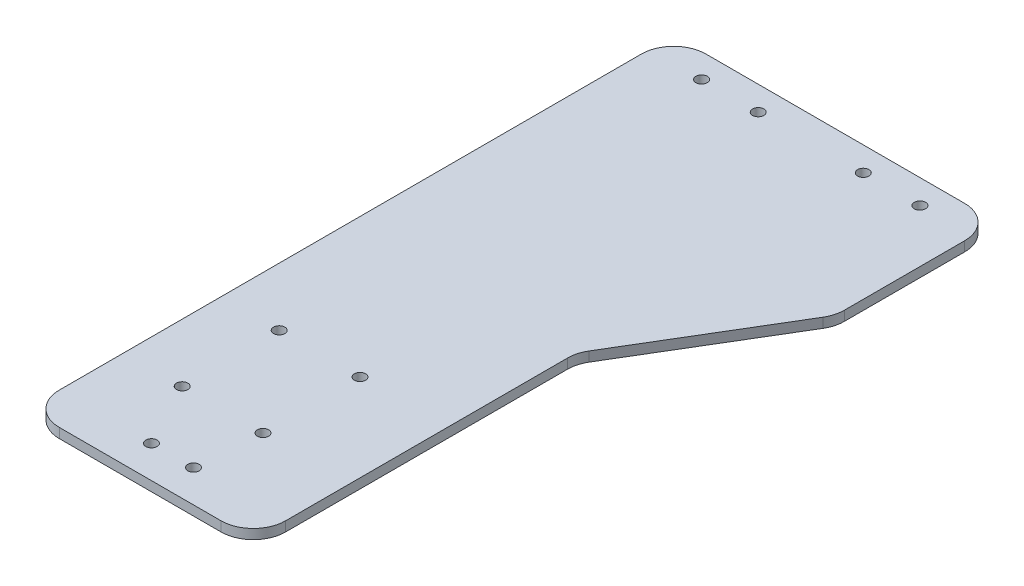
ISO-10303-21;
HEADER;
FILE_DESCRIPTION(('STEP AP214'),'2;1');
FILE_NAME('part.step','',(''),(''),'','','');
FILE_SCHEMA(('AUTOMOTIVE_DESIGN { 1 0 10303 214 1 1 1 1 }'));
ENDSEC;
DATA;
#1=APPLICATION_CONTEXT('core data for automotive mechanical design processes');
#2=APPLICATION_PROTOCOL_DEFINITION('international standard','automotive_design',2000,#1);
#3=PRODUCT_CONTEXT('',#1,'mechanical');
#4=PRODUCT('Part','Part','',(#3));
#5=PRODUCT_RELATED_PRODUCT_CATEGORY('part','',(#4));
#6=PRODUCT_DEFINITION_FORMATION('','',#4);
#7=PRODUCT_DEFINITION_CONTEXT('part definition',#1,'design');
#8=PRODUCT_DEFINITION('design','',#6,#7);
#9=PRODUCT_DEFINITION_SHAPE('','',#8);
#10=(LENGTH_UNIT() NAMED_UNIT(*) SI_UNIT(.MILLI.,.METRE.));
#11=(NAMED_UNIT(*) PLANE_ANGLE_UNIT() SI_UNIT($,.RADIAN.));
#12=(NAMED_UNIT(*) SI_UNIT($,.STERADIAN.) SOLID_ANGLE_UNIT());
#13=UNCERTAINTY_MEASURE_WITH_UNIT(LENGTH_MEASURE(1.E-05),#10,'distance_accuracy_value','');
#14=(GEOMETRIC_REPRESENTATION_CONTEXT(3) GLOBAL_UNCERTAINTY_ASSIGNED_CONTEXT((#13)) GLOBAL_UNIT_ASSIGNED_CONTEXT((#10,
#11,#12)) REPRESENTATION_CONTEXT('',''));
#15=CARTESIAN_POINT('',(0.,0.,0.));
#16=DIRECTION('',(0.,0.,1.));
#17=DIRECTION('',(1.,0.,0.));
#18=AXIS2_PLACEMENT_3D('',#15,#16,#17);
#19=CARTESIAN_POINT('',(50.,3.,100.));
#20=DIRECTION('',(-1.,0.,0.));
#21=DIRECTION('',(0.,0.,1.));
#22=AXIS2_PLACEMENT_3D('',#19,#20,#21);
#23=PLANE('',#22);
#24=DIRECTION('',(0.,0.,-1.));
#25=VECTOR('',#24,1.);
#26=CARTESIAN_POINT('',(50.,0.,100.));
#27=LINE('',#26,#25);
#28=CARTESIAN_POINT('',(50.,0.,-52.7698396494843));
#29=VERTEX_POINT('',#28);
#30=CARTESIAN_POINT('',(50.,0.,-90.));
#31=VERTEX_POINT('',#30);
#32=EDGE_CURVE('E161',#29,#31,#27,.T.);
#33=ORIENTED_EDGE('',*,*,#32,.T.);
#34=DIRECTION('',(0.,-1.,0.));
#35=VECTOR('',#34,1.);
#36=CARTESIAN_POINT('',(50.,3.,-90.));
#37=LINE('',#36,#35);
#38=CARTESIAN_POINT('',(50.,3.,-90.));
#39=VERTEX_POINT('',#38);
#40=EDGE_CURVE('E140',#31,#39,#37,.F.);
#41=ORIENTED_EDGE('',*,*,#40,.T.);
#42=DIRECTION('',(0.,0.,-1.));
#43=VECTOR('',#42,1.);
#44=CARTESIAN_POINT('',(50.,3.,100.));
#45=LINE('',#44,#43);
#46=CARTESIAN_POINT('',(50.,3.,-52.7698396494843));
#47=VERTEX_POINT('',#46);
#48=EDGE_CURVE('E171',#47,#39,#45,.T.);
#49=ORIENTED_EDGE('',*,*,#48,.F.);
#50=DIRECTION('',(0.,1.,0.));
#51=VECTOR('',#50,1.);
#52=CARTESIAN_POINT('',(50.,3.,-52.7698396494843));
#53=LINE('',#52,#51);
#54=EDGE_CURVE('E145',#47,#29,#53,.F.);
#55=ORIENTED_EDGE('',*,*,#54,.T.);
#56=EDGE_LOOP('',(#33,#41,#49,#55));
#57=FACE_BOUND('',#56,.T.);
#58=ADVANCED_FACE('F43',(#57),#23,.F.);
#59=CARTESIAN_POINT('',(-50.,3.,-100.));
#60=DIRECTION('',(0.,0.,1.));
#61=DIRECTION('',(1.,0.,0.));
#62=AXIS2_PLACEMENT_3D('',#59,#60,#61);
#63=PLANE('',#62);
#64=DIRECTION('',(-1.,0.,0.));
#65=VECTOR('',#64,1.);
#66=CARTESIAN_POINT('',(-50.,3.,-100.));
#67=LINE('',#66,#65);
#68=CARTESIAN_POINT('',(40.,3.,-100.));
#69=VERTEX_POINT('',#68);
#70=CARTESIAN_POINT('',(-40.,3.,-100.));
#71=VERTEX_POINT('',#70);
#72=EDGE_CURVE('E154',#69,#71,#67,.T.);
#73=ORIENTED_EDGE('',*,*,#72,.F.);
#74=DIRECTION('',(0.,-1.,0.));
#75=VECTOR('',#74,1.);
#76=CARTESIAN_POINT('',(40.,3.,-100.));
#77=LINE('',#76,#75);
#78=CARTESIAN_POINT('',(40.,0.,-100.));
#79=VERTEX_POINT('',#78);
#80=EDGE_CURVE('E139',#69,#79,#77,.T.);
#81=ORIENTED_EDGE('',*,*,#80,.T.);
#82=DIRECTION('',(-1.,0.,0.));
#83=VECTOR('',#82,1.);
#84=CARTESIAN_POINT('',(-50.,0.,-100.));
#85=LINE('',#84,#83);
#86=CARTESIAN_POINT('',(-40.,0.,-100.));
#87=VERTEX_POINT('',#86);
#88=EDGE_CURVE('E152',#79,#87,#85,.T.);
#89=ORIENTED_EDGE('',*,*,#88,.T.);
#90=DIRECTION('',(0.,-1.,0.));
#91=VECTOR('',#90,1.);
#92=CARTESIAN_POINT('',(-40.,3.,-100.));
#93=LINE('',#92,#91);
#94=EDGE_CURVE('E156',#87,#71,#93,.F.);
#95=ORIENTED_EDGE('',*,*,#94,.T.);
#96=EDGE_LOOP('',(#73,#81,#89,#95));
#97=FACE_BOUND('',#96,.T.);
#98=ADVANCED_FACE('F151',(#97),#63,.F.);
#99=CARTESIAN_POINT('',(-50.,3.,100.));
#100=DIRECTION('',(1.,0.,0.));
#101=DIRECTION('',(0.,0.,-1.));
#102=AXIS2_PLACEMENT_3D('',#99,#100,#101);
#103=PLANE('',#102);
#104=DIRECTION('',(0.,0.,1.));
#105=VECTOR('',#104,1.);
#106=CARTESIAN_POINT('',(-50.,3.,100.));
#107=LINE('',#106,#105);
#108=CARTESIAN_POINT('',(-50.,3.,-90.));
#109=VERTEX_POINT('',#108);
#110=CARTESIAN_POINT('',(-50.,3.,90.));
#111=VERTEX_POINT('',#110);
#112=EDGE_CURVE('E279',#109,#111,#107,.T.);
#113=ORIENTED_EDGE('',*,*,#112,.F.);
#114=DIRECTION('',(0.,-1.,0.));
#115=VECTOR('',#114,1.);
#116=CARTESIAN_POINT('',(-50.,3.,-90.));
#117=LINE('',#116,#115);
#118=CARTESIAN_POINT('',(-50.,0.,-90.));
#119=VERTEX_POINT('',#118);
#120=EDGE_CURVE('E198',#109,#119,#117,.T.);
#121=ORIENTED_EDGE('',*,*,#120,.T.);
#122=DIRECTION('',(0.,0.,1.));
#123=VECTOR('',#122,1.);
#124=CARTESIAN_POINT('',(-50.,0.,100.));
#125=LINE('',#124,#123);
#126=CARTESIAN_POINT('',(-50.,0.,90.));
#127=VERTEX_POINT('',#126);
#128=EDGE_CURVE('E160',#119,#127,#125,.T.);
#129=ORIENTED_EDGE('',*,*,#128,.T.);
#130=DIRECTION('',(0.,-1.,0.));
#131=VECTOR('',#130,1.);
#132=CARTESIAN_POINT('',(-50.,3.,90.));
#133=LINE('',#132,#131);
#134=EDGE_CURVE('E60',#127,#111,#133,.F.);
#135=ORIENTED_EDGE('',*,*,#134,.T.);
#136=EDGE_LOOP('',(#113,#121,#129,#135));
#137=FACE_BOUND('',#136,.T.);
#138=ADVANCED_FACE('F292',(#137),#103,.F.);
#139=CARTESIAN_POINT('',(-50.,3.,100.));
#140=DIRECTION('',(0.,0.,-1.));
#141=DIRECTION('',(-1.,0.,0.));
#142=AXIS2_PLACEMENT_3D('',#139,#140,#141);
#143=PLANE('',#142);
#144=DIRECTION('',(1.,0.,0.));
#145=VECTOR('',#144,1.);
#146=CARTESIAN_POINT('',(-50.,3.,100.));
#147=LINE('',#146,#145);
#148=CARTESIAN_POINT('',(-40.,3.,100.));
#149=VERTEX_POINT('',#148);
#150=CARTESIAN_POINT('',(9.99999999999999,3.,100.));
#151=VERTEX_POINT('',#150);
#152=EDGE_CURVE('E176',#149,#151,#147,.T.);
#153=ORIENTED_EDGE('',*,*,#152,.F.);
#154=DIRECTION('',(0.,-1.,0.));
#155=VECTOR('',#154,1.);
#156=CARTESIAN_POINT('',(-40.,3.,100.));
#157=LINE('',#156,#155);
#158=CARTESIAN_POINT('',(-40.,0.,100.));
#159=VERTEX_POINT('',#158);
#160=EDGE_CURVE('E204',#149,#159,#157,.T.);
#161=ORIENTED_EDGE('',*,*,#160,.T.);
#162=DIRECTION('',(1.,0.,0.));
#163=VECTOR('',#162,1.);
#164=CARTESIAN_POINT('',(-50.,0.,100.));
#165=LINE('',#164,#163);
#166=CARTESIAN_POINT('',(9.99999999999999,0.,100.));
#167=VERTEX_POINT('',#166);
#168=EDGE_CURVE('E163',#159,#167,#165,.T.);
#169=ORIENTED_EDGE('',*,*,#168,.T.);
#170=DIRECTION('',(0.,1.,0.));
#171=VECTOR('',#170,1.);
#172=CARTESIAN_POINT('',(9.99999999999999,3.,100.));
#173=LINE('',#172,#171);
#174=EDGE_CURVE('E201',#167,#151,#173,.T.);
#175=ORIENTED_EDGE('',*,*,#174,.T.);
#176=EDGE_LOOP('',(#153,#161,#169,#175));
#177=FACE_BOUND('',#176,.T.);
#178=ADVANCED_FACE('F287',(#177),#143,.F.);
#179=CARTESIAN_POINT('',(0.,3.,0.));
#180=DIRECTION('',(0.,-1.,0.));
#181=DIRECTION('',(0.,0.,-1.));
#182=AXIS2_PLACEMENT_3D('',#179,#180,#181);
#183=PLANE('',#182);
#184=CARTESIAN_POINT('',(-32.,3.,70.0000000000021));
#185=DIRECTION('',(0.,1.,0.));
#186=DIRECTION('',(0.,0.,-1.));
#187=AXIS2_PLACEMENT_3D('',#184,#185,#186);
#188=CIRCLE('',#187,1.75);
#189=CARTESIAN_POINT('',(-32.,3.,68.2500000000021));
#190=VERTEX_POINT('',#189);
#191=EDGE_CURVE('E578',#190,#190,#188,.T.);
#192=ORIENTED_EDGE('',*,*,#191,.F.);
#193=EDGE_LOOP('',(#192));
#194=FACE_BOUND('',#193,.T.);
#195=CARTESIAN_POINT('',(-7.,3.,70.0000000000021));
#196=DIRECTION('',(0.,1.,0.));
#197=DIRECTION('',(0.,0.,-1.));
#198=AXIS2_PLACEMENT_3D('',#195,#196,#197);
#199=CIRCLE('',#198,1.75000000000001);
#200=CARTESIAN_POINT('',(-7.,3.,68.2500000000021));
#201=VERTEX_POINT('',#200);
#202=EDGE_CURVE('E579',#201,#201,#199,.T.);
#203=ORIENTED_EDGE('',*,*,#202,.F.);
#204=EDGE_LOOP('',(#203));
#205=FACE_BOUND('',#204,.T.);
#206=CARTESIAN_POINT('',(-7.00000000000001,3.,40.0000000000021));
#207=DIRECTION('',(0.,1.,0.));
#208=DIRECTION('',(0.,0.,1.));
#209=AXIS2_PLACEMENT_3D('',#206,#207,#208);
#210=CIRCLE('',#209,1.75000000000001);
#211=CARTESIAN_POINT('',(-7.00000000000001,3.,41.7500000000021));
#212=VERTEX_POINT('',#211);
#213=EDGE_CURVE('E582',#212,#212,#210,.T.);
#214=ORIENTED_EDGE('',*,*,#213,.F.);
#215=EDGE_LOOP('',(#214));
#216=FACE_BOUND('',#215,.T.);
#217=CARTESIAN_POINT('',(-32.,3.,40.0000000000021));
#218=DIRECTION('',(0.,1.,0.));
#219=DIRECTION('',(0.,0.,1.));
#220=AXIS2_PLACEMENT_3D('',#217,#218,#219);
#221=CIRCLE('',#220,1.75);
#222=CARTESIAN_POINT('',(-32.,3.,41.7500000000021));
#223=VERTEX_POINT('',#222);
#224=EDGE_CURVE('E236',#223,#223,#221,.T.);
#225=ORIENTED_EDGE('',*,*,#224,.F.);
#226=EDGE_LOOP('',(#225));
#227=FACE_BOUND('',#226,.T.);
#228=CARTESIAN_POINT('',(-8.50000000000007,3.,90.0000000000001));
#229=DIRECTION('',(0.,-1.,0.));
#230=DIRECTION('',(0.,0.,-1.));
#231=AXIS2_PLACEMENT_3D('',#228,#229,#230);
#232=CIRCLE('',#231,1.75000000000001);
#233=CARTESIAN_POINT('',(-8.50000000000007,3.,88.25));
#234=VERTEX_POINT('',#233);
#235=EDGE_CURVE('E258',#234,#234,#232,.T.);
#236=ORIENTED_EDGE('',*,*,#235,.T.);
#237=EDGE_LOOP('',(#236));
#238=FACE_BOUND('',#237,.T.);
#239=CARTESIAN_POINT('',(-21.5000000000001,3.,90.0000000000001));
#240=DIRECTION('',(0.,-1.,0.));
#241=DIRECTION('',(0.,0.,-1.));
#242=AXIS2_PLACEMENT_3D('',#239,#240,#241);
#243=CIRCLE('',#242,1.75000000000001);
#244=CARTESIAN_POINT('',(-21.5000000000001,3.,88.25));
#245=VERTEX_POINT('',#244);
#246=EDGE_CURVE('E252',#245,#245,#243,.T.);
#247=ORIENTED_EDGE('',*,*,#246,.T.);
#248=EDGE_LOOP('',(#247));
#249=FACE_BOUND('',#248,.T.);
#250=CARTESIAN_POINT('',(33.6473971870736,3.,-92.5000000000002));
#251=DIRECTION('',(0.,1.,0.));
#252=DIRECTION('',(0.,0.,1.));
#253=AXIS2_PLACEMENT_3D('',#250,#251,#252);
#254=CIRCLE('',#253,1.75000000000167);
#255=CARTESIAN_POINT('',(33.6473971870736,3.,-90.7499999999985));
#256=VERTEX_POINT('',#255);
#257=EDGE_CURVE('E222',#256,#256,#254,.T.);
#258=ORIENTED_EDGE('',*,*,#257,.F.);
#259=EDGE_LOOP('',(#258));
#260=FACE_BOUND('',#259,.T.);
#261=CARTESIAN_POINT('',(-16.3526028129264,3.,-92.5));
#262=DIRECTION('',(0.,1.,0.));
#263=DIRECTION('',(0.,0.,1.));
#264=AXIS2_PLACEMENT_3D('',#261,#262,#263);
#265=CIRCLE('',#264,1.74999999999997);
#266=CARTESIAN_POINT('',(-16.3526028129264,3.,-90.75));
#267=VERTEX_POINT('',#266);
#268=EDGE_CURVE('E261',#267,#267,#265,.T.);
#269=ORIENTED_EDGE('',*,*,#268,.F.);
#270=EDGE_LOOP('',(#269));
#271=FACE_BOUND('',#270,.T.);
#272=CARTESIAN_POINT('',(-33.8673309883633,3.,-92.5));
#273=DIRECTION('',(0.,1.,0.));
#274=DIRECTION('',(0.,0.,1.));
#275=AXIS2_PLACEMENT_3D('',#272,#273,#274);
#276=CIRCLE('',#275,1.74999999999997);
#277=CARTESIAN_POINT('',(-33.8673309883633,3.,-90.75));
#278=VERTEX_POINT('',#277);
#279=EDGE_CURVE('E267',#278,#278,#276,.T.);
#280=ORIENTED_EDGE('',*,*,#279,.F.);
#281=EDGE_LOOP('',(#280));
#282=FACE_BOUND('',#281,.T.);
#283=CARTESIAN_POINT('',(16.1326690116367,3.,-92.5000000000002));
#284=DIRECTION('',(0.,1.,0.));
#285=DIRECTION('',(0.,0.,1.));
#286=AXIS2_PLACEMENT_3D('',#283,#284,#285);
#287=CIRCLE('',#286,1.75000000000167);
#288=CARTESIAN_POINT('',(16.1326690116367,3.,-90.7499999999985));
#289=VERTEX_POINT('',#288);
#290=EDGE_CURVE('E264',#289,#289,#287,.T.);
#291=ORIENTED_EDGE('',*,*,#290,.F.);
#292=EDGE_LOOP('',(#291));
#293=FACE_BOUND('',#292,.T.);
#294=ORIENTED_EDGE('',*,*,#48,.T.);
#295=CARTESIAN_POINT('',(40.,3.,-90.));
#296=DIRECTION('',(0.,-1.,0.));
#297=DIRECTION('',(0.,0.,-1.));
#298=AXIS2_PLACEMENT_3D('',#295,#296,#297);
#299=CIRCLE('',#298,10.);
#300=EDGE_CURVE('E195',#39,#69,#299,.F.);
#301=ORIENTED_EDGE('',*,*,#300,.T.);
#302=ORIENTED_EDGE('',*,*,#72,.T.);
#303=CARTESIAN_POINT('',(-40.,3.,-90.));
#304=DIRECTION('',(0.,-1.,0.));
#305=DIRECTION('',(0.,0.,-1.));
#306=AXIS2_PLACEMENT_3D('',#303,#304,#305);
#307=CIRCLE('',#306,10.);
#308=EDGE_CURVE('E67',#71,#109,#307,.F.);
#309=ORIENTED_EDGE('',*,*,#308,.T.);
#310=ORIENTED_EDGE('',*,*,#112,.T.);
#311=CARTESIAN_POINT('',(-40.,3.,90.));
#312=DIRECTION('',(0.,-1.,0.));
#313=DIRECTION('',(0.,0.,-1.));
#314=AXIS2_PLACEMENT_3D('',#311,#312,#313);
#315=CIRCLE('',#314,10.);
#316=EDGE_CURVE('E192',#111,#149,#315,.F.);
#317=ORIENTED_EDGE('',*,*,#316,.T.);
#318=ORIENTED_EDGE('',*,*,#152,.T.);
#319=CARTESIAN_POINT('',(9.99999999999999,3.,90.));
#320=DIRECTION('',(0.,-1.,0.));
#321=DIRECTION('',(0.,0.,-1.));
#322=AXIS2_PLACEMENT_3D('',#319,#320,#321);
#323=CIRCLE('',#322,10.);
#324=CARTESIAN_POINT('',(20.,3.,90.));
#325=VERTEX_POINT('',#324);
#326=EDGE_CURVE('E190',#151,#325,#323,.F.);
#327=ORIENTED_EDGE('',*,*,#326,.T.);
#328=DIRECTION('',(0.,0.,1.));
#329=VECTOR('',#328,1.);
#330=CARTESIAN_POINT('',(20.,3.,100.));
#331=LINE('',#330,#329);
#332=CARTESIAN_POINT('',(20.,3.,2.76983964948434));
#333=VERTEX_POINT('',#332);
#334=EDGE_CURVE('E165',#333,#325,#331,.T.);
#335=ORIENTED_EDGE('',*,*,#334,.F.);
#336=CARTESIAN_POINT('',(30.,3.,2.76983964948434));
#337=DIRECTION('',(0.,-1.,0.));
#338=DIRECTION('',(0.,0.,-1.));
#339=AXIS2_PLACEMENT_3D('',#336,#337,#338);
#340=CIRCLE('',#339,10.);
#341=CARTESIAN_POINT('',(21.4250707428746,3.,-2.37511790479093));
#342=VERTEX_POINT('',#341);
#343=EDGE_CURVE('E52',#333,#342,#340,.T.);
#344=ORIENTED_EDGE('',*,*,#343,.T.);
#345=DIRECTION('',(-0.514495755427527,0.,0.857492925712544));
#346=VECTOR('',#345,1.);
#347=CARTESIAN_POINT('',(20.,3.,0.));
#348=LINE('',#347,#346);
#349=CARTESIAN_POINT('',(48.5749292571254,3.,-47.6248820952091));
#350=VERTEX_POINT('',#349);
#351=EDGE_CURVE('E231',#350,#342,#348,.T.);
#352=ORIENTED_EDGE('',*,*,#351,.F.);
#353=CARTESIAN_POINT('',(40.,3.,-52.7698396494843));
#354=DIRECTION('',(0.,-1.,0.));
#355=DIRECTION('',(0.,0.,-1.));
#356=AXIS2_PLACEMENT_3D('',#353,#354,#355);
#357=CIRCLE('',#356,10.);
#358=EDGE_CURVE('E188',#350,#47,#357,.F.);
#359=ORIENTED_EDGE('',*,*,#358,.T.);
#360=EDGE_LOOP('',(#294,#301,#302,#309,#310,#317,#318,#327,#335,#344,#352,#359));
#361=FACE_BOUND('',#360,.T.);
#362=ADVANCED_FACE('F282',(#194,#205,#216,#227,#238,#249,#260,#271,#282,#293,#361),#183,.F.);
#363=CARTESIAN_POINT('',(0.,0.,0.));
#364=DIRECTION('',(0.,-1.,0.));
#365=DIRECTION('',(0.,0.,-1.));
#366=AXIS2_PLACEMENT_3D('',#363,#364,#365);
#367=PLANE('',#366);
#368=CARTESIAN_POINT('',(-32.,0.,70.0000000000021));
#369=DIRECTION('',(0.,-1.,0.));
#370=DIRECTION('',(0.,0.,-1.));
#371=AXIS2_PLACEMENT_3D('',#368,#369,#370);
#372=CIRCLE('',#371,1.75);
#373=CARTESIAN_POINT('',(-32.,0.,68.2500000000021));
#374=VERTEX_POINT('',#373);
#375=EDGE_CURVE('E47',#374,#374,#372,.T.);
#376=ORIENTED_EDGE('',*,*,#375,.F.);
#377=EDGE_LOOP('',(#376));
#378=FACE_BOUND('',#377,.T.);
#379=CARTESIAN_POINT('',(-7.,0.,70.0000000000021));
#380=DIRECTION('',(0.,-1.,0.));
#381=DIRECTION('',(0.,0.,-1.));
#382=AXIS2_PLACEMENT_3D('',#379,#380,#381);
#383=CIRCLE('',#382,1.75000000000001);
#384=CARTESIAN_POINT('',(-7.,0.,68.2500000000021));
#385=VERTEX_POINT('',#384);
#386=EDGE_CURVE('E238',#385,#385,#383,.T.);
#387=ORIENTED_EDGE('',*,*,#386,.F.);
#388=EDGE_LOOP('',(#387));
#389=FACE_BOUND('',#388,.T.);
#390=CARTESIAN_POINT('',(-7.00000000000001,0.,40.0000000000021));
#391=DIRECTION('',(0.,-1.,0.));
#392=DIRECTION('',(0.,0.,-1.));
#393=AXIS2_PLACEMENT_3D('',#390,#391,#392);
#394=CIRCLE('',#393,1.75000000000001);
#395=CARTESIAN_POINT('',(-7.00000000000001,0.,38.2500000000021));
#396=VERTEX_POINT('',#395);
#397=EDGE_CURVE('E235',#396,#396,#394,.T.);
#398=ORIENTED_EDGE('',*,*,#397,.F.);
#399=EDGE_LOOP('',(#398));
#400=FACE_BOUND('',#399,.T.);
#401=CARTESIAN_POINT('',(-32.,0.,40.0000000000021));
#402=DIRECTION('',(0.,-1.,0.));
#403=DIRECTION('',(0.,0.,-1.));
#404=AXIS2_PLACEMENT_3D('',#401,#402,#403);
#405=CIRCLE('',#404,1.75);
#406=CARTESIAN_POINT('',(-32.,0.,38.2500000000021));
#407=VERTEX_POINT('',#406);
#408=EDGE_CURVE('E232',#407,#407,#405,.T.);
#409=ORIENTED_EDGE('',*,*,#408,.F.);
#410=EDGE_LOOP('',(#409));
#411=FACE_BOUND('',#410,.T.);
#412=CARTESIAN_POINT('',(-8.50000000000007,0.,90.0000000000001));
#413=DIRECTION('',(0.,-1.,0.));
#414=DIRECTION('',(0.,0.,-1.));
#415=AXIS2_PLACEMENT_3D('',#412,#413,#414);
#416=CIRCLE('',#415,1.75000000000001);
#417=CARTESIAN_POINT('',(-8.50000000000007,0.,88.25));
#418=VERTEX_POINT('',#417);
#419=EDGE_CURVE('E247',#418,#418,#416,.T.);
#420=ORIENTED_EDGE('',*,*,#419,.F.);
#421=EDGE_LOOP('',(#420));
#422=FACE_BOUND('',#421,.T.);
#423=CARTESIAN_POINT('',(-21.5000000000001,0.,90.0000000000001));
#424=DIRECTION('',(0.,-1.,0.));
#425=DIRECTION('',(0.,0.,-1.));
#426=AXIS2_PLACEMENT_3D('',#423,#424,#425);
#427=CIRCLE('',#426,1.75000000000001);
#428=CARTESIAN_POINT('',(-21.5000000000001,0.,88.25));
#429=VERTEX_POINT('',#428);
#430=EDGE_CURVE('E243',#429,#429,#427,.T.);
#431=ORIENTED_EDGE('',*,*,#430,.F.);
#432=EDGE_LOOP('',(#431));
#433=FACE_BOUND('',#432,.T.);
#434=CARTESIAN_POINT('',(33.6473971870736,0.,-92.5000000000002));
#435=DIRECTION('',(0.,-1.,0.));
#436=DIRECTION('',(0.,0.,-1.));
#437=AXIS2_PLACEMENT_3D('',#434,#435,#436);
#438=CIRCLE('',#437,1.75000000000167);
#439=CARTESIAN_POINT('',(33.6473971870736,0.,-94.2500000000018));
#440=VERTEX_POINT('',#439);
#441=EDGE_CURVE('E228',#440,#440,#438,.T.);
#442=ORIENTED_EDGE('',*,*,#441,.F.);
#443=EDGE_LOOP('',(#442));
#444=FACE_BOUND('',#443,.T.);
#445=CARTESIAN_POINT('',(-16.3526028129264,0.,-92.5));
#446=DIRECTION('',(0.,-1.,0.));
#447=DIRECTION('',(0.,0.,-1.));
#448=AXIS2_PLACEMENT_3D('',#445,#446,#447);
#449=CIRCLE('',#448,1.74999999999997);
#450=CARTESIAN_POINT('',(-16.3526028129264,0.,-94.25));
#451=VERTEX_POINT('',#450);
#452=EDGE_CURVE('E225',#451,#451,#449,.T.);
#453=ORIENTED_EDGE('',*,*,#452,.F.);
#454=EDGE_LOOP('',(#453));
#455=FACE_BOUND('',#454,.T.);
#456=CARTESIAN_POINT('',(-33.8673309883633,0.,-92.5));
#457=DIRECTION('',(0.,-1.,0.));
#458=DIRECTION('',(0.,0.,-1.));
#459=AXIS2_PLACEMENT_3D('',#456,#457,#458);
#460=CIRCLE('',#459,1.74999999999997);
#461=CARTESIAN_POINT('',(-33.8673309883633,0.,-94.25));
#462=VERTEX_POINT('',#461);
#463=EDGE_CURVE('E221',#462,#462,#460,.T.);
#464=ORIENTED_EDGE('',*,*,#463,.F.);
#465=EDGE_LOOP('',(#464));
#466=FACE_BOUND('',#465,.T.);
#467=CARTESIAN_POINT('',(16.1326690116367,0.,-92.5000000000002));
#468=DIRECTION('',(0.,-1.,0.));
#469=DIRECTION('',(0.,0.,-1.));
#470=AXIS2_PLACEMENT_3D('',#467,#468,#469);
#471=CIRCLE('',#470,1.75000000000167);
#472=CARTESIAN_POINT('',(16.1326690116367,0.,-94.2500000000018));
#473=VERTEX_POINT('',#472);
#474=EDGE_CURVE('E218',#473,#473,#471,.T.);
#475=ORIENTED_EDGE('',*,*,#474,.F.);
#476=EDGE_LOOP('',(#475));
#477=FACE_BOUND('',#476,.T.);
#478=ORIENTED_EDGE('',*,*,#88,.F.);
#479=CARTESIAN_POINT('',(40.,0.,-90.));
#480=DIRECTION('',(0.,-1.,0.));
#481=DIRECTION('',(0.,0.,-1.));
#482=AXIS2_PLACEMENT_3D('',#479,#480,#481);
#483=CIRCLE('',#482,10.);
#484=EDGE_CURVE('E135',#79,#31,#483,.T.);
#485=ORIENTED_EDGE('',*,*,#484,.T.);
#486=ORIENTED_EDGE('',*,*,#32,.F.);
#487=CARTESIAN_POINT('',(40.,0.,-52.7698396494843));
#488=DIRECTION('',(0.,-1.,0.));
#489=DIRECTION('',(0.,0.,-1.));
#490=AXIS2_PLACEMENT_3D('',#487,#488,#489);
#491=CIRCLE('',#490,10.);
#492=CARTESIAN_POINT('',(48.5749292571254,0.,-47.6248820952091));
#493=VERTEX_POINT('',#492);
#494=EDGE_CURVE('E155',#29,#493,#491,.T.);
#495=ORIENTED_EDGE('',*,*,#494,.T.);
#496=DIRECTION('',(0.514495755427527,0.,-0.857492925712544));
#497=VECTOR('',#496,1.);
#498=CARTESIAN_POINT('',(14.7058823529412,0.,8.8235294117647));
#499=LINE('',#498,#497);
#500=CARTESIAN_POINT('',(21.4250707428746,0.,-2.37511790479093));
#501=VERTEX_POINT('',#500);
#502=EDGE_CURVE('E172',#501,#493,#499,.T.);
#503=ORIENTED_EDGE('',*,*,#502,.F.);
#504=CARTESIAN_POINT('',(30.,0.,2.76983964948434));
#505=DIRECTION('',(0.,-1.,0.));
#506=DIRECTION('',(0.,0.,-1.));
#507=AXIS2_PLACEMENT_3D('',#504,#505,#506);
#508=CIRCLE('',#507,10.);
#509=CARTESIAN_POINT('',(20.,0.,2.76983964948434));
#510=VERTEX_POINT('',#509);
#511=EDGE_CURVE('E11',#501,#510,#508,.F.);
#512=ORIENTED_EDGE('',*,*,#511,.T.);
#513=DIRECTION('',(0.,0.,-1.));
#514=VECTOR('',#513,1.);
#515=CARTESIAN_POINT('',(20.,0.,0.));
#516=LINE('',#515,#514);
#517=CARTESIAN_POINT('',(20.,0.,90.));
#518=VERTEX_POINT('',#517);
#519=EDGE_CURVE('E175',#518,#510,#516,.T.);
#520=ORIENTED_EDGE('',*,*,#519,.F.);
#521=CARTESIAN_POINT('',(9.99999999999999,0.,90.));
#522=DIRECTION('',(0.,-1.,0.));
#523=DIRECTION('',(0.,0.,-1.));
#524=AXIS2_PLACEMENT_3D('',#521,#522,#523);
#525=CIRCLE('',#524,10.);
#526=EDGE_CURVE('E181',#518,#167,#525,.T.);
#527=ORIENTED_EDGE('',*,*,#526,.T.);
#528=ORIENTED_EDGE('',*,*,#168,.F.);
#529=CARTESIAN_POINT('',(-40.,0.,90.));
#530=DIRECTION('',(0.,-1.,0.));
#531=DIRECTION('',(0.,0.,-1.));
#532=AXIS2_PLACEMENT_3D('',#529,#530,#531);
#533=CIRCLE('',#532,10.);
#534=EDGE_CURVE('E183',#159,#127,#533,.T.);
#535=ORIENTED_EDGE('',*,*,#534,.T.);
#536=ORIENTED_EDGE('',*,*,#128,.F.);
#537=CARTESIAN_POINT('',(-40.,0.,-90.));
#538=DIRECTION('',(0.,-1.,0.));
#539=DIRECTION('',(0.,0.,-1.));
#540=AXIS2_PLACEMENT_3D('',#537,#538,#539);
#541=CIRCLE('',#540,10.);
#542=EDGE_CURVE('E146',#119,#87,#541,.T.);
#543=ORIENTED_EDGE('',*,*,#542,.T.);
#544=EDGE_LOOP('',(#478,#485,#486,#495,#503,#512,#520,#527,#528,#535,#536,#543));
#545=FACE_BOUND('',#544,.T.);
#546=ADVANCED_FACE('F158',(#378,#389,#400,#411,#422,#433,#444,#455,#466,#477,#545),#367,.T.);
#547=CARTESIAN_POINT('',(20.,-7.,100.));
#548=DIRECTION('',(-1.,0.,0.));
#549=DIRECTION('',(0.,0.,1.));
#550=AXIS2_PLACEMENT_3D('',#547,#548,#549);
#551=PLANE('',#550);
#552=ORIENTED_EDGE('',*,*,#334,.T.);
#553=DIRECTION('',(0.,1.,0.));
#554=VECTOR('',#553,1.);
#555=CARTESIAN_POINT('',(20.,-7.,90.));
#556=LINE('',#555,#554);
#557=EDGE_CURVE('E210',#325,#518,#556,.F.);
#558=ORIENTED_EDGE('',*,*,#557,.T.);
#559=ORIENTED_EDGE('',*,*,#519,.T.);
#560=DIRECTION('',(0.,1.,0.));
#561=VECTOR('',#560,1.);
#562=CARTESIAN_POINT('',(20.,3.,2.76983964948434));
#563=LINE('',#562,#561);
#564=EDGE_CURVE('E207',#510,#333,#563,.T.);
#565=ORIENTED_EDGE('',*,*,#564,.T.);
#566=EDGE_LOOP('',(#552,#558,#559,#565));
#567=FACE_BOUND('',#566,.T.);
#568=ADVANCED_FACE('F314',(#567),#551,.F.);
#569=CARTESIAN_POINT('',(20.,-7.,0.));
#570=DIRECTION('',(-0.857492925712544,0.,-0.514495755427526));
#571=DIRECTION('',(-0.514495755427527,0.,0.857492925712544));
#572=AXIS2_PLACEMENT_3D('',#569,#570,#571);
#573=PLANE('',#572);
#574=ORIENTED_EDGE('',*,*,#351,.T.);
#575=DIRECTION('',(0.,1.,0.));
#576=VECTOR('',#575,1.);
#577=CARTESIAN_POINT('',(21.4250707428746,0.,-2.37511790479093));
#578=LINE('',#577,#576);
#579=EDGE_CURVE('E215',#342,#501,#578,.F.);
#580=ORIENTED_EDGE('',*,*,#579,.T.);
#581=ORIENTED_EDGE('',*,*,#502,.T.);
#582=DIRECTION('',(0.,1.,0.));
#583=VECTOR('',#582,1.);
#584=CARTESIAN_POINT('',(48.5749292571254,-7.,-47.6248820952091));
#585=LINE('',#584,#583);
#586=EDGE_CURVE('E212',#493,#350,#585,.T.);
#587=ORIENTED_EDGE('',*,*,#586,.T.);
#588=EDGE_LOOP('',(#574,#580,#581,#587));
#589=FACE_BOUND('',#588,.T.);
#590=ADVANCED_FACE('F306',(#589),#573,.F.);
#591=CARTESIAN_POINT('',(40.,3.,-90.));
#592=DIRECTION('',(0.,-1.,0.));
#593=DIRECTION('',(0.,0.,-1.));
#594=AXIS2_PLACEMENT_3D('',#591,#592,#593);
#595=CYLINDRICAL_SURFACE('',#594,10.);
#596=ORIENTED_EDGE('',*,*,#300,.F.);
#597=ORIENTED_EDGE('',*,*,#40,.F.);
#598=ORIENTED_EDGE('',*,*,#484,.F.);
#599=ORIENTED_EDGE('',*,*,#80,.F.);
#600=EDGE_LOOP('',(#596,#597,#598,#599));
#601=FACE_BOUND('',#600,.T.);
#602=ADVANCED_FACE('F138',(#601),#595,.T.);
#603=CARTESIAN_POINT('',(-40.,3.,-90.));
#604=DIRECTION('',(0.,-1.,0.));
#605=DIRECTION('',(0.,0.,-1.));
#606=AXIS2_PLACEMENT_3D('',#603,#604,#605);
#607=CYLINDRICAL_SURFACE('',#606,10.);
#608=ORIENTED_EDGE('',*,*,#308,.F.);
#609=ORIENTED_EDGE('',*,*,#94,.F.);
#610=ORIENTED_EDGE('',*,*,#542,.F.);
#611=ORIENTED_EDGE('',*,*,#120,.F.);
#612=EDGE_LOOP('',(#608,#609,#610,#611));
#613=FACE_BOUND('',#612,.T.);
#614=ADVANCED_FACE('F295',(#613),#607,.T.);
#615=CARTESIAN_POINT('',(-40.,3.,90.));
#616=DIRECTION('',(0.,-1.,0.));
#617=DIRECTION('',(0.,0.,-1.));
#618=AXIS2_PLACEMENT_3D('',#615,#616,#617);
#619=CYLINDRICAL_SURFACE('',#618,10.);
#620=ORIENTED_EDGE('',*,*,#316,.F.);
#621=ORIENTED_EDGE('',*,*,#134,.F.);
#622=ORIENTED_EDGE('',*,*,#534,.F.);
#623=ORIENTED_EDGE('',*,*,#160,.F.);
#624=EDGE_LOOP('',(#620,#621,#622,#623));
#625=FACE_BOUND('',#624,.T.);
#626=ADVANCED_FACE('F291',(#625),#619,.T.);
#627=CARTESIAN_POINT('',(9.99999999999999,3.,90.));
#628=DIRECTION('',(0.,1.,0.));
#629=DIRECTION('',(0.,0.,1.));
#630=AXIS2_PLACEMENT_3D('',#627,#628,#629);
#631=CYLINDRICAL_SURFACE('',#630,10.);
#632=ORIENTED_EDGE('',*,*,#526,.F.);
#633=ORIENTED_EDGE('',*,*,#557,.F.);
#634=ORIENTED_EDGE('',*,*,#326,.F.);
#635=ORIENTED_EDGE('',*,*,#174,.F.);
#636=EDGE_LOOP('',(#632,#633,#634,#635));
#637=FACE_BOUND('',#636,.T.);
#638=ADVANCED_FACE('F317',(#637),#631,.T.);
#639=CARTESIAN_POINT('',(30.,-7.,2.76983964948434));
#640=DIRECTION('',(0.,-1.,0.));
#641=DIRECTION('',(0.,0.,-1.));
#642=AXIS2_PLACEMENT_3D('',#639,#640,#641);
#643=CYLINDRICAL_SURFACE('',#642,10.);
#644=ORIENTED_EDGE('',*,*,#511,.F.);
#645=ORIENTED_EDGE('',*,*,#579,.F.);
#646=ORIENTED_EDGE('',*,*,#343,.F.);
#647=ORIENTED_EDGE('',*,*,#564,.F.);
#648=EDGE_LOOP('',(#644,#645,#646,#647));
#649=FACE_BOUND('',#648,.T.);
#650=ADVANCED_FACE('F309',(#649),#643,.F.);
#651=CARTESIAN_POINT('',(40.,-7.,-52.7698396494843));
#652=DIRECTION('',(0.,1.,0.));
#653=DIRECTION('',(0.,0.,1.));
#654=AXIS2_PLACEMENT_3D('',#651,#652,#653);
#655=CYLINDRICAL_SURFACE('',#654,10.);
#656=ORIENTED_EDGE('',*,*,#494,.F.);
#657=ORIENTED_EDGE('',*,*,#54,.F.);
#658=ORIENTED_EDGE('',*,*,#358,.F.);
#659=ORIENTED_EDGE('',*,*,#586,.F.);
#660=EDGE_LOOP('',(#656,#657,#658,#659));
#661=FACE_BOUND('',#660,.T.);
#662=ADVANCED_FACE('F45',(#661),#655,.T.);
#663=CARTESIAN_POINT('',(16.1326690116367,-18.,-92.5000000000002));
#664=DIRECTION('',(0.,1.,0.));
#665=DIRECTION('',(0.,0.,1.));
#666=AXIS2_PLACEMENT_3D('',#663,#664,#665);
#667=CYLINDRICAL_SURFACE('',#666,1.75000000000167);
#668=ORIENTED_EDGE('',*,*,#474,.T.);
#669=EDGE_LOOP('',(#668));
#670=FACE_BOUND('',#669,.T.);
#671=ORIENTED_EDGE('',*,*,#290,.T.);
#672=EDGE_LOOP('',(#671));
#673=FACE_BOUND('',#672,.T.);
#674=ADVANCED_FACE('F367',(#670,#673),#667,.F.);
#675=CARTESIAN_POINT('',(-33.8673309883633,-18.,-92.5));
#676=DIRECTION('',(0.,1.,0.));
#677=DIRECTION('',(0.,0.,1.));
#678=AXIS2_PLACEMENT_3D('',#675,#676,#677);
#679=CYLINDRICAL_SURFACE('',#678,1.74999999999997);
#680=ORIENTED_EDGE('',*,*,#463,.T.);
#681=EDGE_LOOP('',(#680));
#682=FACE_BOUND('',#681,.T.);
#683=ORIENTED_EDGE('',*,*,#279,.T.);
#684=EDGE_LOOP('',(#683));
#685=FACE_BOUND('',#684,.T.);
#686=ADVANCED_FACE('F376',(#682,#685),#679,.F.);
#687=CARTESIAN_POINT('',(-16.3526028129264,-18.,-92.5));
#688=DIRECTION('',(0.,1.,0.));
#689=DIRECTION('',(0.,0.,1.));
#690=AXIS2_PLACEMENT_3D('',#687,#688,#689);
#691=CYLINDRICAL_SURFACE('',#690,1.74999999999997);
#692=ORIENTED_EDGE('',*,*,#452,.T.);
#693=EDGE_LOOP('',(#692));
#694=FACE_BOUND('',#693,.T.);
#695=ORIENTED_EDGE('',*,*,#268,.T.);
#696=EDGE_LOOP('',(#695));
#697=FACE_BOUND('',#696,.T.);
#698=ADVANCED_FACE('F387',(#694,#697),#691,.F.);
#699=CARTESIAN_POINT('',(33.6473971870736,-18.,-92.5000000000002));
#700=DIRECTION('',(0.,1.,0.));
#701=DIRECTION('',(0.,0.,1.));
#702=AXIS2_PLACEMENT_3D('',#699,#700,#701);
#703=CYLINDRICAL_SURFACE('',#702,1.75000000000167);
#704=ORIENTED_EDGE('',*,*,#441,.T.);
#705=EDGE_LOOP('',(#704));
#706=FACE_BOUND('',#705,.T.);
#707=ORIENTED_EDGE('',*,*,#257,.T.);
#708=EDGE_LOOP('',(#707));
#709=FACE_BOUND('',#708,.T.);
#710=ADVANCED_FACE('F398',(#706,#709),#703,.F.);
#711=CARTESIAN_POINT('',(-21.5000000000001,4.,90.0000000000001));
#712=DIRECTION('',(0.,-1.,0.));
#713=DIRECTION('',(0.,0.,-1.));
#714=AXIS2_PLACEMENT_3D('',#711,#712,#713);
#715=CYLINDRICAL_SURFACE('',#714,1.75000000000001);
#716=ORIENTED_EDGE('',*,*,#430,.T.);
#717=EDGE_LOOP('',(#716));
#718=FACE_BOUND('',#717,.T.);
#719=ORIENTED_EDGE('',*,*,#246,.F.);
#720=EDGE_LOOP('',(#719));
#721=FACE_BOUND('',#720,.T.);
#722=ADVANCED_FACE('F409',(#718,#721),#715,.F.);
#723=CARTESIAN_POINT('',(-8.50000000000007,4.,90.0000000000001));
#724=DIRECTION('',(0.,-1.,0.));
#725=DIRECTION('',(0.,0.,-1.));
#726=AXIS2_PLACEMENT_3D('',#723,#724,#725);
#727=CYLINDRICAL_SURFACE('',#726,1.75000000000001);
#728=ORIENTED_EDGE('',*,*,#419,.T.);
#729=EDGE_LOOP('',(#728));
#730=FACE_BOUND('',#729,.T.);
#731=ORIENTED_EDGE('',*,*,#235,.F.);
#732=EDGE_LOOP('',(#731));
#733=FACE_BOUND('',#732,.T.);
#734=ADVANCED_FACE('F420',(#730,#733),#727,.F.);
#735=CARTESIAN_POINT('',(-32.,-1.,40.0000000000021));
#736=DIRECTION('',(0.,1.,0.));
#737=DIRECTION('',(0.,0.,1.));
#738=AXIS2_PLACEMENT_3D('',#735,#736,#737);
#739=CYLINDRICAL_SURFACE('',#738,1.75);
#740=ORIENTED_EDGE('',*,*,#408,.T.);
#741=EDGE_LOOP('',(#740));
#742=FACE_BOUND('',#741,.T.);
#743=ORIENTED_EDGE('',*,*,#224,.T.);
#744=EDGE_LOOP('',(#743));
#745=FACE_BOUND('',#744,.T.);
#746=ADVANCED_FACE('F430',(#742,#745),#739,.F.);
#747=CARTESIAN_POINT('',(-7.00000000000001,-1.,40.0000000000021));
#748=DIRECTION('',(0.,1.,0.));
#749=DIRECTION('',(0.,0.,1.));
#750=AXIS2_PLACEMENT_3D('',#747,#748,#749);
#751=CYLINDRICAL_SURFACE('',#750,1.75000000000001);
#752=ORIENTED_EDGE('',*,*,#397,.T.);
#753=EDGE_LOOP('',(#752));
#754=FACE_BOUND('',#753,.T.);
#755=ORIENTED_EDGE('',*,*,#213,.T.);
#756=EDGE_LOOP('',(#755));
#757=FACE_BOUND('',#756,.T.);
#758=ADVANCED_FACE('F457',(#754,#757),#751,.F.);
#759=CARTESIAN_POINT('',(-7.,-1.,70.0000000000021));
#760=DIRECTION('',(0.,1.,0.));
#761=DIRECTION('',(0.,0.,1.));
#762=AXIS2_PLACEMENT_3D('',#759,#760,#761);
#763=CYLINDRICAL_SURFACE('',#762,1.75000000000001);
#764=ORIENTED_EDGE('',*,*,#386,.T.);
#765=EDGE_LOOP('',(#764));
#766=FACE_BOUND('',#765,.T.);
#767=ORIENTED_EDGE('',*,*,#202,.T.);
#768=EDGE_LOOP('',(#767));
#769=FACE_BOUND('',#768,.T.);
#770=ADVANCED_FACE('F468',(#766,#769),#763,.F.);
#771=CARTESIAN_POINT('',(-32.,-1.,70.0000000000021));
#772=DIRECTION('',(0.,1.,0.));
#773=DIRECTION('',(0.,0.,1.));
#774=AXIS2_PLACEMENT_3D('',#771,#772,#773);
#775=CYLINDRICAL_SURFACE('',#774,1.75);
#776=ORIENTED_EDGE('',*,*,#375,.T.);
#777=EDGE_LOOP('',(#776));
#778=FACE_BOUND('',#777,.T.);
#779=ORIENTED_EDGE('',*,*,#191,.T.);
#780=EDGE_LOOP('',(#779));
#781=FACE_BOUND('',#780,.T.);
#782=ADVANCED_FACE('F479',(#778,#781),#775,.F.);
#783=CLOSED_SHELL('',(#58,#98,#138,#178,#362,#546,#568,#590,#602,#614,#626,#638,#650,#662,#674,
#686,#698,#710,#722,#734,#746,#758,#770,#782));
#784=MANIFOLD_SOLID_BREP('B2',#783);
#785=ADVANCED_BREP_SHAPE_REPRESENTATION('',(#18,#784),#14);
#786=SHAPE_DEFINITION_REPRESENTATION(#9,#785);
ENDSEC;
END-ISO-10303-21;
